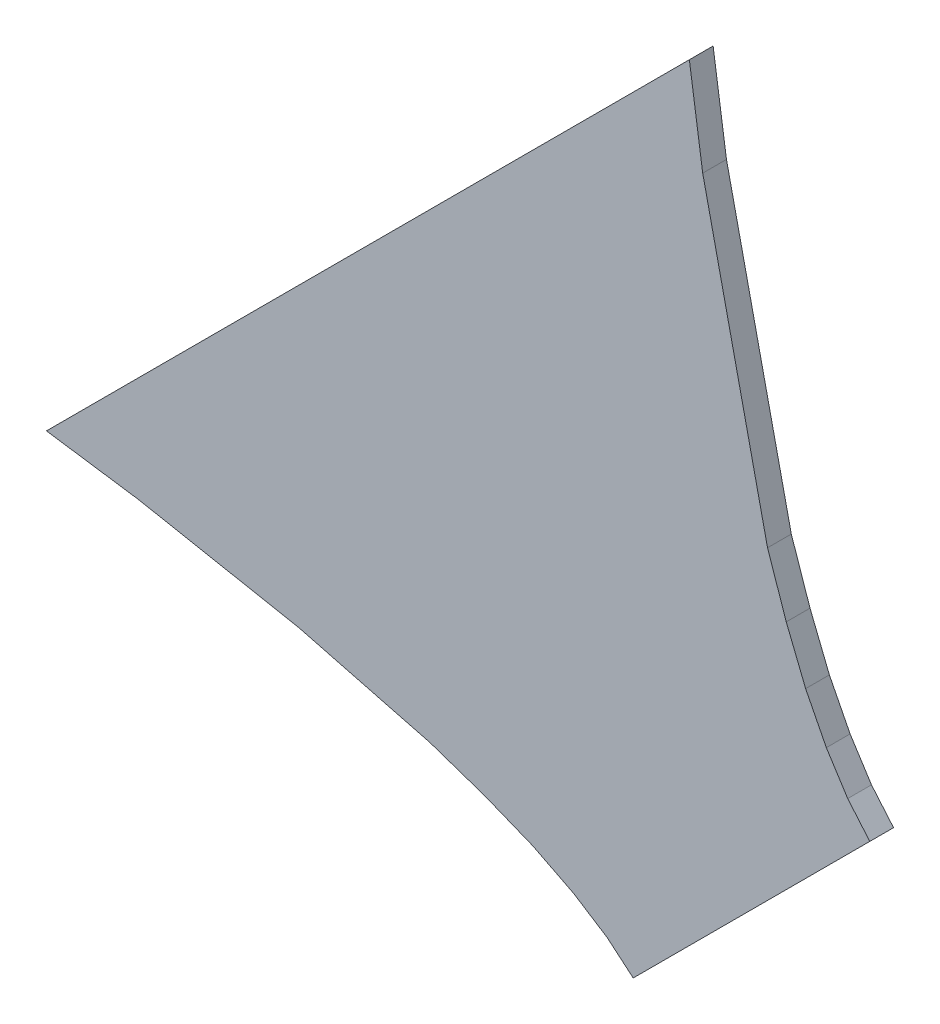
ISO-10303-21;
HEADER;
FILE_DESCRIPTION(('STEP AP214'),'2;1');
FILE_NAME('part.step','',(''),(''),'','','');
FILE_SCHEMA(('AUTOMOTIVE_DESIGN { 1 0 10303 214 1 1 1 1 }'));
ENDSEC;
DATA;
#1=APPLICATION_CONTEXT('core data for automotive mechanical design processes');
#2=APPLICATION_PROTOCOL_DEFINITION('international standard','automotive_design',2000,#1);
#3=PRODUCT_CONTEXT('',#1,'mechanical');
#4=PRODUCT('Part','Part','',(#3));
#5=PRODUCT_RELATED_PRODUCT_CATEGORY('part','',(#4));
#6=PRODUCT_DEFINITION_FORMATION('','',#4);
#7=PRODUCT_DEFINITION_CONTEXT('part definition',#1,'design');
#8=PRODUCT_DEFINITION('design','',#6,#7);
#9=PRODUCT_DEFINITION_SHAPE('','',#8);
#10=(LENGTH_UNIT() NAMED_UNIT(*) SI_UNIT(.MILLI.,.METRE.));
#11=(NAMED_UNIT(*) PLANE_ANGLE_UNIT() SI_UNIT($,.RADIAN.));
#12=(NAMED_UNIT(*) SI_UNIT($,.STERADIAN.) SOLID_ANGLE_UNIT());
#13=UNCERTAINTY_MEASURE_WITH_UNIT(LENGTH_MEASURE(1.E-05),#10,'distance_accuracy_value','');
#14=(GEOMETRIC_REPRESENTATION_CONTEXT(3) GLOBAL_UNCERTAINTY_ASSIGNED_CONTEXT((#13)) GLOBAL_UNIT_ASSIGNED_CONTEXT((#10,
#11,#12)) REPRESENTATION_CONTEXT('',''));
#15=CARTESIAN_POINT('',(0.,0.,0.));
#16=DIRECTION('',(0.,0.,1.));
#17=DIRECTION('',(1.,0.,0.));
#18=AXIS2_PLACEMENT_3D('',#15,#16,#17);
#19=CARTESIAN_POINT('',(61.0719985961914,74.5419998168945,0.));
#20=DIRECTION('',(-0.763425936268127,-0.645895378395862,0.));
#21=DIRECTION('',(-0.645895378395862,0.763425936268127,0.));
#22=AXIS2_PLACEMENT_3D('',#19,#20,#21);
#23=PLANE('',#22);
#24=DIRECTION('',(-0.645895378395862,0.763425936268127,0.));
#25=VECTOR('',#24,1.);
#26=CARTESIAN_POINT('',(61.0719985961914,74.5419998168945,0.03556));
#27=LINE('',#26,#25);
#28=CARTESIAN_POINT('',(61.0719985961914,74.5419998168945,0.03556));
#29=VERTEX_POINT('',#28);
#30=CARTESIAN_POINT('',(61.0390014648438,74.5810012817383,0.03556));
#31=VERTEX_POINT('',#30);
#32=EDGE_CURVE('E11',#29,#31,#27,.T.);
#33=ORIENTED_EDGE('',*,*,#32,.F.);
#34=DIRECTION('',(0.,0.,1.));
#35=VECTOR('',#34,1.);
#36=CARTESIAN_POINT('',(61.0719985961914,74.5419998168945,0.));
#37=LINE('',#36,#35);
#38=CARTESIAN_POINT('',(61.0719985961914,74.5419998168945,0.));
#39=VERTEX_POINT('',#38);
#40=EDGE_CURVE('E24',#39,#29,#37,.T.);
#41=ORIENTED_EDGE('',*,*,#40,.F.);
#42=DIRECTION('',(-0.645895378395862,0.763425936268127,0.));
#43=VECTOR('',#42,1.);
#44=CARTESIAN_POINT('',(61.0719985961914,74.5419998168945,0.));
#45=LINE('',#44,#43);
#46=CARTESIAN_POINT('',(61.0390014648438,74.5810012817383,0.));
#47=VERTEX_POINT('',#46);
#48=EDGE_CURVE('E154',#39,#47,#45,.T.);
#49=ORIENTED_EDGE('',*,*,#48,.T.);
#50=DIRECTION('',(0.,0.,1.));
#51=VECTOR('',#50,1.);
#52=CARTESIAN_POINT('',(61.0390014648438,74.5810012817383,0.));
#53=LINE('',#52,#51);
#54=EDGE_CURVE('E37',#47,#31,#53,.T.);
#55=ORIENTED_EDGE('',*,*,#54,.T.);
#56=EDGE_LOOP('',(#33,#41,#49,#55));
#57=FACE_BOUND('',#56,.T.);
#58=ADVANCED_FACE('F17',(#57),#23,.F.);
#59=CARTESIAN_POINT('',(61.0390014648438,74.5810012817383,0.));
#60=DIRECTION('',(-0.84223755306674,-0.539106579633518,0.));
#61=DIRECTION('',(-0.539106579633518,0.84223755306674,0.));
#62=AXIS2_PLACEMENT_3D('',#59,#60,#61);
#63=PLANE('',#62);
#64=DIRECTION('',(-0.539106579633518,0.84223755306674,0.));
#65=VECTOR('',#64,1.);
#66=CARTESIAN_POINT('',(61.0390014648438,74.5810012817383,0.03556));
#67=LINE('',#66,#65);
#68=CARTESIAN_POINT('',(61.0069999694824,74.6309967041016,0.03556));
#69=VERTEX_POINT('',#68);
#70=EDGE_CURVE('E266',#31,#69,#67,.T.);
#71=ORIENTED_EDGE('',*,*,#70,.F.);
#72=ORIENTED_EDGE('',*,*,#54,.F.);
#73=DIRECTION('',(-0.539106579633518,0.84223755306674,0.));
#74=VECTOR('',#73,1.);
#75=CARTESIAN_POINT('',(61.0390014648438,74.5810012817383,0.));
#76=LINE('',#75,#74);
#77=CARTESIAN_POINT('',(61.0069999694824,74.6309967041016,0.));
#78=VERTEX_POINT('',#77);
#79=EDGE_CURVE('E263',#47,#78,#76,.T.);
#80=ORIENTED_EDGE('',*,*,#79,.T.);
#81=DIRECTION('',(0.,0.,1.));
#82=VECTOR('',#81,1.);
#83=CARTESIAN_POINT('',(61.0069999694824,74.6309967041016,0.));
#84=LINE('',#83,#82);
#85=EDGE_CURVE('E261',#78,#69,#84,.T.);
#86=ORIENTED_EDGE('',*,*,#85,.T.);
#87=EDGE_LOOP('',(#71,#72,#80,#86));
#88=FACE_BOUND('',#87,.T.);
#89=ADVANCED_FACE('F274',(#88),#63,.F.);
#90=CARTESIAN_POINT('',(61.0069999694824,74.6309967041016,0.));
#91=DIRECTION('',(-0.891509544863293,-0.453001911052971,0.));
#92=DIRECTION('',(-0.453001911052971,0.891509544863293,0.));
#93=AXIS2_PLACEMENT_3D('',#90,#91,#92);
#94=PLANE('',#93);
#95=DIRECTION('',(-0.453001911052971,0.891509544863293,0.));
#96=VECTOR('',#95,1.);
#97=CARTESIAN_POINT('',(61.0069999694824,74.6309967041016,0.03556));
#98=LINE('',#97,#96);
#99=CARTESIAN_POINT('',(60.976001739502,74.6920013427734,0.03556));
#100=VERTEX_POINT('',#99);
#101=EDGE_CURVE('E258',#69,#100,#98,.T.);
#102=ORIENTED_EDGE('',*,*,#101,.F.);
#103=ORIENTED_EDGE('',*,*,#85,.F.);
#104=DIRECTION('',(-0.453001911052971,0.891509544863293,0.));
#105=VECTOR('',#104,1.);
#106=CARTESIAN_POINT('',(61.0069999694824,74.6309967041016,0.));
#107=LINE('',#106,#105);
#108=CARTESIAN_POINT('',(60.976001739502,74.6920013427734,0.));
#109=VERTEX_POINT('',#108);
#110=EDGE_CURVE('E255',#78,#109,#107,.T.);
#111=ORIENTED_EDGE('',*,*,#110,.T.);
#112=DIRECTION('',(0.,0.,1.));
#113=VECTOR('',#112,1.);
#114=CARTESIAN_POINT('',(60.976001739502,74.6920013427734,0.));
#115=LINE('',#114,#113);
#116=EDGE_CURVE('E253',#109,#100,#115,.T.);
#117=ORIENTED_EDGE('',*,*,#116,.T.);
#118=EDGE_LOOP('',(#102,#103,#111,#117));
#119=FACE_BOUND('',#118,.T.);
#120=ADVANCED_FACE('F280',(#119),#94,.F.);
#121=CARTESIAN_POINT('',(60.976001739502,74.6920013427734,0.));
#122=DIRECTION('',(-0.927568982596219,-0.373651953728889,0.));
#123=DIRECTION('',(-0.373651953728889,0.927568982596219,0.));
#124=AXIS2_PLACEMENT_3D('',#121,#122,#123);
#125=PLANE('',#124);
#126=DIRECTION('',(-0.373651953728889,0.927568982596219,0.));
#127=VECTOR('',#126,1.);
#128=CARTESIAN_POINT('',(60.976001739502,74.6920013427734,0.03556));
#129=LINE('',#128,#127);
#130=CARTESIAN_POINT('',(60.9469985961914,74.7639999389648,0.03556));
#131=VERTEX_POINT('',#130);
#132=EDGE_CURVE('E250',#100,#131,#129,.T.);
#133=ORIENTED_EDGE('',*,*,#132,.F.);
#134=ORIENTED_EDGE('',*,*,#116,.F.);
#135=DIRECTION('',(-0.373651953728889,0.927568982596219,0.));
#136=VECTOR('',#135,1.);
#137=CARTESIAN_POINT('',(60.976001739502,74.6920013427734,0.));
#138=LINE('',#137,#136);
#139=CARTESIAN_POINT('',(60.9469985961914,74.7639999389648,0.));
#140=VERTEX_POINT('',#139);
#141=EDGE_CURVE('E247',#109,#140,#138,.T.);
#142=ORIENTED_EDGE('',*,*,#141,.T.);
#143=DIRECTION('',(0.,0.,1.));
#144=VECTOR('',#143,1.);
#145=CARTESIAN_POINT('',(60.9469985961914,74.7639999389648,0.));
#146=LINE('',#145,#144);
#147=EDGE_CURVE('E245',#140,#131,#146,.T.);
#148=ORIENTED_EDGE('',*,*,#147,.T.);
#149=EDGE_LOOP('',(#133,#134,#142,#148));
#150=FACE_BOUND('',#149,.T.);
#151=ADVANCED_FACE('F282',(#150),#125,.F.);
#152=CARTESIAN_POINT('',(60.9469985961914,74.7639999389648,0.));
#153=DIRECTION('',(-0.946351169524934,-0.323140006713482,0.));
#154=DIRECTION('',(-0.323140006713482,0.946351169524934,0.));
#155=AXIS2_PLACEMENT_3D('',#152,#153,#154);
#156=PLANE('',#155);
#157=DIRECTION('',(-0.323140006713482,0.946351169524934,0.));
#158=VECTOR('',#157,1.);
#159=CARTESIAN_POINT('',(60.9469985961914,74.7639999389648,0.03556));
#160=LINE('',#159,#158);
#161=CARTESIAN_POINT('',(60.9189987182617,74.8460006713867,0.03556));
#162=VERTEX_POINT('',#161);
#163=EDGE_CURVE('E242',#131,#162,#160,.T.);
#164=ORIENTED_EDGE('',*,*,#163,.F.);
#165=ORIENTED_EDGE('',*,*,#147,.F.);
#166=DIRECTION('',(-0.323140006713482,0.946351169524934,0.));
#167=VECTOR('',#166,1.);
#168=CARTESIAN_POINT('',(60.9469985961914,74.7639999389648,0.));
#169=LINE('',#168,#167);
#170=CARTESIAN_POINT('',(60.9189987182617,74.8460006713867,0.));
#171=VERTEX_POINT('',#170);
#172=EDGE_CURVE('E239',#140,#171,#169,.T.);
#173=ORIENTED_EDGE('',*,*,#172,.T.);
#174=DIRECTION('',(0.,0.,1.));
#175=VECTOR('',#174,1.);
#176=CARTESIAN_POINT('',(60.9189987182617,74.8460006713867,0.));
#177=LINE('',#176,#175);
#178=EDGE_CURVE('E237',#171,#162,#177,.T.);
#179=ORIENTED_EDGE('',*,*,#178,.T.);
#180=EDGE_LOOP('',(#164,#165,#173,#179));
#181=FACE_BOUND('',#180,.T.);
#182=ADVANCED_FACE('F287',(#181),#156,.F.);
#183=CARTESIAN_POINT('',(60.9189987182617,74.8460006713867,0.));
#184=DIRECTION('',(-0.97623916620404,-0.216695847604982,0.));
#185=DIRECTION('',(-0.216695847604982,0.97623916620404,0.));
#186=AXIS2_PLACEMENT_3D('',#183,#184,#185);
#187=PLANE('',#186);
#188=DIRECTION('',(-0.216695847604982,0.97623916620404,0.));
#189=VECTOR('',#188,1.);
#190=CARTESIAN_POINT('',(60.9189987182617,74.8460006713867,0.03556));
#191=LINE('',#190,#189);
#192=CARTESIAN_POINT('',(60.8219985961914,75.2829971313477,0.03556));
#193=VERTEX_POINT('',#192);
#194=EDGE_CURVE('E234',#162,#193,#191,.T.);
#195=ORIENTED_EDGE('',*,*,#194,.F.);
#196=ORIENTED_EDGE('',*,*,#178,.F.);
#197=DIRECTION('',(-0.216695847604982,0.97623916620404,0.));
#198=VECTOR('',#197,1.);
#199=CARTESIAN_POINT('',(60.9189987182617,74.8460006713867,0.));
#200=LINE('',#199,#198);
#201=CARTESIAN_POINT('',(60.8219985961914,75.2829971313477,0.));
#202=VERTEX_POINT('',#201);
#203=EDGE_CURVE('E231',#171,#202,#200,.T.);
#204=ORIENTED_EDGE('',*,*,#203,.T.);
#205=DIRECTION('',(0.,0.,1.));
#206=VECTOR('',#205,1.);
#207=CARTESIAN_POINT('',(60.8219985961914,75.2829971313477,0.));
#208=LINE('',#207,#206);
#209=EDGE_CURVE('E229',#202,#193,#208,.T.);
#210=ORIENTED_EDGE('',*,*,#209,.T.);
#211=EDGE_LOOP('',(#195,#196,#204,#210));
#212=FACE_BOUND('',#211,.T.);
#213=ADVANCED_FACE('F290',(#212),#187,.F.);
#214=CARTESIAN_POINT('',(60.8219985961914,75.2829971313477,0.));
#215=DIRECTION('',(-0.989511166848601,-0.144456397165095,0.));
#216=DIRECTION('',(-0.144456397165095,0.989511166848601,0.));
#217=AXIS2_PLACEMENT_3D('',#214,#215,#216);
#218=PLANE('',#217);
#219=DIRECTION('',(-0.144456397165095,0.989511166848601,0.));
#220=VECTOR('',#219,1.);
#221=CARTESIAN_POINT('',(60.8219985961914,75.2829971313477,0.03556));
#222=LINE('',#221,#220);
#223=CARTESIAN_POINT('',(60.8019981384277,75.4199981689453,0.03556));
#224=VERTEX_POINT('',#223);
#225=EDGE_CURVE('E226',#193,#224,#222,.T.);
#226=ORIENTED_EDGE('',*,*,#225,.F.);
#227=ORIENTED_EDGE('',*,*,#209,.F.);
#228=DIRECTION('',(-0.144456397165095,0.989511166848601,0.));
#229=VECTOR('',#228,1.);
#230=CARTESIAN_POINT('',(60.8219985961914,75.2829971313477,0.));
#231=LINE('',#230,#229);
#232=CARTESIAN_POINT('',(60.8019981384277,75.4199981689453,0.));
#233=VERTEX_POINT('',#232);
#234=EDGE_CURVE('E223',#202,#233,#231,.T.);
#235=ORIENTED_EDGE('',*,*,#234,.T.);
#236=DIRECTION('',(0.,0.,1.));
#237=VECTOR('',#236,1.);
#238=CARTESIAN_POINT('',(60.8019981384277,75.4199981689453,0.));
#239=LINE('',#238,#237);
#240=EDGE_CURVE('E221',#233,#224,#239,.T.);
#241=ORIENTED_EDGE('',*,*,#240,.T.);
#242=EDGE_LOOP('',(#226,#227,#235,#241));
#243=FACE_BOUND('',#242,.T.);
#244=ADVANCED_FACE('F295',(#243),#218,.F.);
#245=CARTESIAN_POINT('',(60.8019981384277,75.4199981689453,0.));
#246=DIRECTION('',(0.707106781186548,-0.707106781186548,0.));
#247=DIRECTION('',(-0.707106781186548,-0.707106781186548,0.));
#248=AXIS2_PLACEMENT_3D('',#245,#246,#247);
#249=PLANE('',#248);
#250=DIRECTION('',(-0.707106781186548,-0.707106781186548,0.));
#251=VECTOR('',#250,1.);
#252=CARTESIAN_POINT('',(60.8019981384277,75.4199981689453,0.03556));
#253=LINE('',#252,#251);
#254=CARTESIAN_POINT('',(59.8400001525879,74.4580001831055,0.03556));
#255=VERTEX_POINT('',#254);
#256=EDGE_CURVE('E218',#224,#255,#253,.T.);
#257=ORIENTED_EDGE('',*,*,#256,.F.);
#258=ORIENTED_EDGE('',*,*,#240,.F.);
#259=DIRECTION('',(-0.707106781186548,-0.707106781186548,0.));
#260=VECTOR('',#259,1.);
#261=CARTESIAN_POINT('',(60.8019981384277,75.4199981689453,0.));
#262=LINE('',#261,#260);
#263=CARTESIAN_POINT('',(59.8400001525879,74.4580001831055,0.));
#264=VERTEX_POINT('',#263);
#265=EDGE_CURVE('E215',#233,#264,#262,.T.);
#266=ORIENTED_EDGE('',*,*,#265,.T.);
#267=DIRECTION('',(0.,0.,1.));
#268=VECTOR('',#267,1.);
#269=CARTESIAN_POINT('',(59.8400001525879,74.4580001831055,0.));
#270=LINE('',#269,#268);
#271=EDGE_CURVE('E213',#264,#255,#270,.T.);
#272=ORIENTED_EDGE('',*,*,#271,.T.);
#273=EDGE_LOOP('',(#257,#258,#266,#272));
#274=FACE_BOUND('',#273,.T.);
#275=ADVANCED_FACE('F298',(#274),#249,.F.);
#276=CARTESIAN_POINT('',(59.8400001525879,74.4580001831055,0.));
#277=DIRECTION('',(0.144429419714034,0.989515104847353,0.));
#278=DIRECTION('',(0.989515104847353,-0.144429419714034,0.));
#279=AXIS2_PLACEMENT_3D('',#276,#277,#278);
#280=PLANE('',#279);
#281=DIRECTION('',(0.989515104847353,-0.144429419714034,0.));
#282=VECTOR('',#281,1.);
#283=CARTESIAN_POINT('',(59.8400001525879,74.4580001831055,0.03556));
#284=LINE('',#283,#282);
#285=CARTESIAN_POINT('',(59.9770011901855,74.4380035400391,0.03556));
#286=VERTEX_POINT('',#285);
#287=EDGE_CURVE('E210',#255,#286,#284,.T.);
#288=ORIENTED_EDGE('',*,*,#287,.F.);
#289=ORIENTED_EDGE('',*,*,#271,.F.);
#290=DIRECTION('',(0.989515104847353,-0.144429419714034,0.));
#291=VECTOR('',#290,1.);
#292=CARTESIAN_POINT('',(59.8400001525879,74.4580001831055,0.));
#293=LINE('',#292,#291);
#294=CARTESIAN_POINT('',(59.9770011901855,74.4380035400391,0.));
#295=VERTEX_POINT('',#294);
#296=EDGE_CURVE('E207',#264,#295,#293,.T.);
#297=ORIENTED_EDGE('',*,*,#296,.T.);
#298=DIRECTION('',(0.,0.,1.));
#299=VECTOR('',#298,1.);
#300=CARTESIAN_POINT('',(59.9770011901855,74.4380035400391,0.));
#301=LINE('',#300,#299);
#302=EDGE_CURVE('E205',#295,#286,#301,.T.);
#303=ORIENTED_EDGE('',*,*,#302,.T.);
#304=EDGE_LOOP('',(#288,#289,#297,#303));
#305=FACE_BOUND('',#304,.T.);
#306=ADVANCED_FACE('F303',(#305),#280,.F.);
#307=CARTESIAN_POINT('',(59.9770011901855,74.4380035400391,0.));
#308=DIRECTION('',(0.188262578969288,0.982118730785557,0.));
#309=DIRECTION('',(0.982118730785557,-0.188262578969288,0.));
#310=AXIS2_PLACEMENT_3D('',#307,#308,#309);
#311=PLANE('',#310);
#312=DIRECTION('',(0.982118730785557,-0.188262578969288,0.));
#313=VECTOR('',#312,1.);
#314=CARTESIAN_POINT('',(59.9770011901855,74.4380035400391,0.03556));
#315=LINE('',#314,#313);
#316=CARTESIAN_POINT('',(60.2169990539551,74.3919982910156,0.03556));
#317=VERTEX_POINT('',#316);
#318=EDGE_CURVE('E202',#286,#317,#315,.T.);
#319=ORIENTED_EDGE('',*,*,#318,.F.);
#320=ORIENTED_EDGE('',*,*,#302,.F.);
#321=DIRECTION('',(0.982118730785557,-0.188262578969288,0.));
#322=VECTOR('',#321,1.);
#323=CARTESIAN_POINT('',(59.9770011901855,74.4380035400391,0.));
#324=LINE('',#323,#322);
#325=CARTESIAN_POINT('',(60.2169990539551,74.3919982910156,0.));
#326=VERTEX_POINT('',#325);
#327=EDGE_CURVE('E199',#295,#326,#324,.T.);
#328=ORIENTED_EDGE('',*,*,#327,.T.);
#329=DIRECTION('',(0.,0.,1.));
#330=VECTOR('',#329,1.);
#331=CARTESIAN_POINT('',(60.2169990539551,74.3919982910156,0.));
#332=LINE('',#331,#330);
#333=EDGE_CURVE('E197',#326,#317,#332,.T.);
#334=ORIENTED_EDGE('',*,*,#333,.T.);
#335=EDGE_LOOP('',(#319,#320,#328,#334));
#336=FACE_BOUND('',#335,.T.);
#337=ADVANCED_FACE('F306',(#336),#311,.F.);
#338=CARTESIAN_POINT('',(60.2169990539551,74.3919982910156,0.));
#339=DIRECTION('',(0.250594572569394,0.968092123818164,0.));
#340=DIRECTION('',(0.968092123818164,-0.250594572569394,0.));
#341=AXIS2_PLACEMENT_3D('',#338,#339,#340);
#342=PLANE('',#341);
#343=DIRECTION('',(0.968092123818164,-0.250594572569394,0.));
#344=VECTOR('',#343,1.);
#345=CARTESIAN_POINT('',(60.2169990539551,74.3919982910156,0.03556));
#346=LINE('',#345,#344);
#347=CARTESIAN_POINT('',(60.4140014648438,74.3410034179688,0.03556));
#348=VERTEX_POINT('',#347);
#349=EDGE_CURVE('E194',#317,#348,#346,.T.);
#350=ORIENTED_EDGE('',*,*,#349,.F.);
#351=ORIENTED_EDGE('',*,*,#333,.F.);
#352=DIRECTION('',(0.968092123818164,-0.250594572569394,0.));
#353=VECTOR('',#352,1.);
#354=CARTESIAN_POINT('',(60.2169990539551,74.3919982910156,0.));
#355=LINE('',#354,#353);
#356=CARTESIAN_POINT('',(60.4140014648438,74.3410034179688,0.));
#357=VERTEX_POINT('',#356);
#358=EDGE_CURVE('E191',#326,#357,#355,.T.);
#359=ORIENTED_EDGE('',*,*,#358,.T.);
#360=DIRECTION('',(0.,0.,1.));
#361=VECTOR('',#360,1.);
#362=CARTESIAN_POINT('',(60.4140014648438,74.3410034179688,0.));
#363=LINE('',#362,#361);
#364=EDGE_CURVE('E189',#357,#348,#363,.T.);
#365=ORIENTED_EDGE('',*,*,#364,.T.);
#366=EDGE_LOOP('',(#350,#351,#359,#365));
#367=FACE_BOUND('',#366,.T.);
#368=ADVANCED_FACE('F311',(#367),#342,.F.);
#369=CARTESIAN_POINT('',(60.4140014648438,74.3410034179688,0.));
#370=DIRECTION('',(0.323153470113885,0.946346572220429,0.));
#371=DIRECTION('',(0.946346572220429,-0.323153470113885,0.));
#372=AXIS2_PLACEMENT_3D('',#369,#370,#371);
#373=PLANE('',#372);
#374=DIRECTION('',(0.946346572220429,-0.323153470113884,0.));
#375=VECTOR('',#374,1.);
#376=CARTESIAN_POINT('',(60.4140014648438,74.3410034179688,0.03556));
#377=LINE('',#376,#375);
#378=CARTESIAN_POINT('',(60.4959983825684,74.3130035400391,0.03556));
#379=VERTEX_POINT('',#378);
#380=EDGE_CURVE('E186',#348,#379,#377,.T.);
#381=ORIENTED_EDGE('',*,*,#380,.F.);
#382=ORIENTED_EDGE('',*,*,#364,.F.);
#383=DIRECTION('',(0.946346572220429,-0.323153470113884,0.));
#384=VECTOR('',#383,1.);
#385=CARTESIAN_POINT('',(60.4140014648438,74.3410034179688,0.));
#386=LINE('',#385,#384);
#387=CARTESIAN_POINT('',(60.4959983825684,74.3130035400391,0.));
#388=VERTEX_POINT('',#387);
#389=EDGE_CURVE('E183',#357,#388,#386,.T.);
#390=ORIENTED_EDGE('',*,*,#389,.T.);
#391=DIRECTION('',(0.,0.,1.));
#392=VECTOR('',#391,1.);
#393=CARTESIAN_POINT('',(60.4959983825684,74.3130035400391,0.));
#394=LINE('',#393,#392);
#395=EDGE_CURVE('E181',#388,#379,#394,.T.);
#396=ORIENTED_EDGE('',*,*,#395,.T.);
#397=EDGE_LOOP('',(#381,#382,#390,#396));
#398=FACE_BOUND('',#397,.T.);
#399=ADVANCED_FACE('F314',(#398),#373,.F.);
#400=CARTESIAN_POINT('',(60.4959983825684,74.3130035400391,0.));
#401=DIRECTION('',(0.373677202662955,0.927558811186649,0.));
#402=DIRECTION('',(0.927558811186649,-0.373677202662955,0.));
#403=AXIS2_PLACEMENT_3D('',#400,#401,#402);
#404=PLANE('',#403);
#405=DIRECTION('',(0.927558811186649,-0.373677202662955,0.));
#406=VECTOR('',#405,1.);
#407=CARTESIAN_POINT('',(60.4959983825684,74.3130035400391,0.03556));
#408=LINE('',#407,#406);
#409=CARTESIAN_POINT('',(60.568000793457,74.2839965820313,0.03556));
#410=VERTEX_POINT('',#409);
#411=EDGE_CURVE('E178',#379,#410,#408,.T.);
#412=ORIENTED_EDGE('',*,*,#411,.F.);
#413=ORIENTED_EDGE('',*,*,#395,.F.);
#414=DIRECTION('',(0.927558811186649,-0.373677202662955,0.));
#415=VECTOR('',#414,1.);
#416=CARTESIAN_POINT('',(60.4959983825684,74.3130035400391,0.));
#417=LINE('',#416,#415);
#418=CARTESIAN_POINT('',(60.568000793457,74.2839965820313,0.));
#419=VERTEX_POINT('',#418);
#420=EDGE_CURVE('E175',#388,#419,#417,.T.);
#421=ORIENTED_EDGE('',*,*,#420,.T.);
#422=DIRECTION('',(0.,0.,1.));
#423=VECTOR('',#422,1.);
#424=CARTESIAN_POINT('',(60.568000793457,74.2839965820313,0.));
#425=LINE('',#424,#423);
#426=EDGE_CURVE('E173',#419,#410,#425,.T.);
#427=ORIENTED_EDGE('',*,*,#426,.T.);
#428=EDGE_LOOP('',(#412,#413,#421,#427));
#429=FACE_BOUND('',#428,.T.);
#430=ADVANCED_FACE('F319',(#429),#404,.F.);
#431=CARTESIAN_POINT('',(60.568000793457,74.2839965820313,0.));
#432=DIRECTION('',(0.453024425850483,0.891498104082583,0.));
#433=DIRECTION('',(0.891498104082583,-0.453024425850483,0.));
#434=AXIS2_PLACEMENT_3D('',#431,#432,#433);
#435=PLANE('',#434);
#436=DIRECTION('',(0.891498104082583,-0.453024425850483,0.));
#437=VECTOR('',#436,1.);
#438=CARTESIAN_POINT('',(60.568000793457,74.2839965820313,0.03556));
#439=LINE('',#438,#437);
#440=CARTESIAN_POINT('',(60.6290016174316,74.2529983520508,0.03556));
#441=VERTEX_POINT('',#440);
#442=EDGE_CURVE('E170',#410,#441,#439,.T.);
#443=ORIENTED_EDGE('',*,*,#442,.F.);
#444=ORIENTED_EDGE('',*,*,#426,.F.);
#445=DIRECTION('',(0.891498104082583,-0.453024425850483,0.));
#446=VECTOR('',#445,1.);
#447=CARTESIAN_POINT('',(60.568000793457,74.2839965820313,0.));
#448=LINE('',#447,#446);
#449=CARTESIAN_POINT('',(60.6290016174316,74.2529983520508,0.));
#450=VERTEX_POINT('',#449);
#451=EDGE_CURVE('E167',#419,#450,#448,.T.);
#452=ORIENTED_EDGE('',*,*,#451,.T.);
#453=DIRECTION('',(0.,0.,1.));
#454=VECTOR('',#453,1.);
#455=CARTESIAN_POINT('',(60.6290016174316,74.2529983520508,0.));
#456=LINE('',#455,#454);
#457=EDGE_CURVE('E165',#450,#441,#456,.T.);
#458=ORIENTED_EDGE('',*,*,#457,.T.);
#459=EDGE_LOOP('',(#443,#444,#452,#458));
#460=FACE_BOUND('',#459,.T.);
#461=ADVANCED_FACE('F322',(#460),#435,.F.);
#462=CARTESIAN_POINT('',(60.6290016174316,74.2529983520508,0.));
#463=DIRECTION('',(0.53903181352048,0.842285405318662,0.));
#464=DIRECTION('',(0.842285405318662,-0.53903181352048,0.));
#465=AXIS2_PLACEMENT_3D('',#462,#463,#464);
#466=PLANE('',#465);
#467=DIRECTION('',(0.842285405318662,-0.53903181352048,0.));
#468=VECTOR('',#467,1.);
#469=CARTESIAN_POINT('',(60.6290016174316,74.2529983520508,0.03556));
#470=LINE('',#469,#468);
#471=CARTESIAN_POINT('',(60.6790008544922,74.2210006713867,0.03556));
#472=VERTEX_POINT('',#471);
#473=EDGE_CURVE('E162',#441,#472,#470,.T.);
#474=ORIENTED_EDGE('',*,*,#473,.F.);
#475=ORIENTED_EDGE('',*,*,#457,.F.);
#476=DIRECTION('',(0.842285405318662,-0.53903181352048,0.));
#477=VECTOR('',#476,1.);
#478=CARTESIAN_POINT('',(60.6290016174316,74.2529983520508,0.));
#479=LINE('',#478,#477);
#480=CARTESIAN_POINT('',(60.6790008544922,74.2210006713867,0.));
#481=VERTEX_POINT('',#480);
#482=EDGE_CURVE('E160',#450,#481,#479,.T.);
#483=ORIENTED_EDGE('',*,*,#482,.T.);
#484=DIRECTION('',(0.,0.,1.));
#485=VECTOR('',#484,1.);
#486=CARTESIAN_POINT('',(60.6790008544922,74.2210006713867,0.));
#487=LINE('',#486,#485);
#488=EDGE_CURVE('E145',#481,#472,#487,.T.);
#489=ORIENTED_EDGE('',*,*,#488,.T.);
#490=EDGE_LOOP('',(#474,#475,#483,#489));
#491=FACE_BOUND('',#490,.T.);
#492=ADVANCED_FACE('F325',(#491),#466,.F.);
#493=CARTESIAN_POINT('',(60.6790008544922,74.2210006713867,0.));
#494=DIRECTION('',(0.645932199012131,0.76339478271688,0.));
#495=DIRECTION('',(0.76339478271688,-0.645932199012131,0.));
#496=AXIS2_PLACEMENT_3D('',#493,#494,#495);
#497=PLANE('',#496);
#498=DIRECTION('',(0.76339478271688,-0.645932199012131,0.));
#499=VECTOR('',#498,1.);
#500=CARTESIAN_POINT('',(60.6790008544922,74.2210006713867,0.03556));
#501=LINE('',#500,#499);
#502=CARTESIAN_POINT('',(60.7179985046387,74.1880035400391,0.03556));
#503=VERTEX_POINT('',#502);
#504=EDGE_CURVE('E149',#472,#503,#501,.T.);
#505=ORIENTED_EDGE('',*,*,#504,.F.);
#506=ORIENTED_EDGE('',*,*,#488,.F.);
#507=DIRECTION('',(0.76339478271688,-0.645932199012131,0.));
#508=VECTOR('',#507,1.);
#509=CARTESIAN_POINT('',(60.6790008544922,74.2210006713867,0.));
#510=LINE('',#509,#508);
#511=CARTESIAN_POINT('',(60.7179985046387,74.1880035400391,0.));
#512=VERTEX_POINT('',#511);
#513=EDGE_CURVE('E141',#481,#512,#510,.T.);
#514=ORIENTED_EDGE('',*,*,#513,.T.);
#515=DIRECTION('',(0.,0.,1.));
#516=VECTOR('',#515,1.);
#517=CARTESIAN_POINT('',(60.7179985046387,74.1880035400391,0.));
#518=LINE('',#517,#516);
#519=EDGE_CURVE('E131',#512,#503,#518,.T.);
#520=ORIENTED_EDGE('',*,*,#519,.T.);
#521=EDGE_LOOP('',(#505,#506,#514,#520));
#522=FACE_BOUND('',#521,.T.);
#523=ADVANCED_FACE('F144',(#522),#497,.F.);
#524=CARTESIAN_POINT('',(60.7179985046387,74.1880035400391,0.));
#525=DIRECTION('',(-0.70710297127213,0.707110591080437,0.));
#526=DIRECTION('',(0.707110591080437,0.70710297127213,0.));
#527=AXIS2_PLACEMENT_3D('',#524,#525,#526);
#528=PLANE('',#527);
#529=DIRECTION('',(0.707110591080437,0.70710297127213,0.));
#530=VECTOR('',#529,1.);
#531=CARTESIAN_POINT('',(60.7179985046387,74.1880035400391,0.03556));
#532=LINE('',#531,#530);
#533=EDGE_CURVE('E137',#503,#29,#532,.T.);
#534=ORIENTED_EDGE('',*,*,#533,.F.);
#535=ORIENTED_EDGE('',*,*,#519,.F.);
#536=DIRECTION('',(0.707110591080437,0.70710297127213,0.));
#537=VECTOR('',#536,1.);
#538=CARTESIAN_POINT('',(60.7179985046387,74.1880035400391,0.));
#539=LINE('',#538,#537);
#540=EDGE_CURVE('E135',#512,#39,#539,.T.);
#541=ORIENTED_EDGE('',*,*,#540,.T.);
#542=ORIENTED_EDGE('',*,*,#40,.T.);
#543=EDGE_LOOP('',(#534,#535,#541,#542));
#544=FACE_BOUND('',#543,.T.);
#545=ADVANCED_FACE('F133',(#544),#528,.F.);
#546=CARTESIAN_POINT('',(61.0719985961914,74.5419998168945,0.));
#547=DIRECTION('',(0.,0.,1.));
#548=DIRECTION('',(1.,0.,0.));
#549=AXIS2_PLACEMENT_3D('',#546,#547,#548);
#550=PLANE('',#549);
#551=ORIENTED_EDGE('',*,*,#540,.F.);
#552=ORIENTED_EDGE('',*,*,#513,.F.);
#553=ORIENTED_EDGE('',*,*,#482,.F.);
#554=ORIENTED_EDGE('',*,*,#451,.F.);
#555=ORIENTED_EDGE('',*,*,#420,.F.);
#556=ORIENTED_EDGE('',*,*,#389,.F.);
#557=ORIENTED_EDGE('',*,*,#358,.F.);
#558=ORIENTED_EDGE('',*,*,#327,.F.);
#559=ORIENTED_EDGE('',*,*,#296,.F.);
#560=ORIENTED_EDGE('',*,*,#265,.F.);
#561=ORIENTED_EDGE('',*,*,#234,.F.);
#562=ORIENTED_EDGE('',*,*,#203,.F.);
#563=ORIENTED_EDGE('',*,*,#172,.F.);
#564=ORIENTED_EDGE('',*,*,#141,.F.);
#565=ORIENTED_EDGE('',*,*,#110,.F.);
#566=ORIENTED_EDGE('',*,*,#79,.F.);
#567=ORIENTED_EDGE('',*,*,#48,.F.);
#568=EDGE_LOOP('',(#551,#552,#553,#554,#555,#556,#557,#558,#559,#560,#561,#562,#563,#564,#565,
#566,#567));
#569=FACE_BOUND('',#568,.T.);
#570=ADVANCED_FACE('F152',(#569),#550,.F.);
#571=CARTESIAN_POINT('',(61.0719985961914,74.5419998168945,0.03556));
#572=DIRECTION('',(0.,0.,1.));
#573=DIRECTION('',(1.,0.,0.));
#574=AXIS2_PLACEMENT_3D('',#571,#572,#573);
#575=PLANE('',#574);
#576=ORIENTED_EDGE('',*,*,#32,.T.);
#577=ORIENTED_EDGE('',*,*,#70,.T.);
#578=ORIENTED_EDGE('',*,*,#101,.T.);
#579=ORIENTED_EDGE('',*,*,#132,.T.);
#580=ORIENTED_EDGE('',*,*,#163,.T.);
#581=ORIENTED_EDGE('',*,*,#194,.T.);
#582=ORIENTED_EDGE('',*,*,#225,.T.);
#583=ORIENTED_EDGE('',*,*,#256,.T.);
#584=ORIENTED_EDGE('',*,*,#287,.T.);
#585=ORIENTED_EDGE('',*,*,#318,.T.);
#586=ORIENTED_EDGE('',*,*,#349,.T.);
#587=ORIENTED_EDGE('',*,*,#380,.T.);
#588=ORIENTED_EDGE('',*,*,#411,.T.);
#589=ORIENTED_EDGE('',*,*,#442,.T.);
#590=ORIENTED_EDGE('',*,*,#473,.T.);
#591=ORIENTED_EDGE('',*,*,#504,.T.);
#592=ORIENTED_EDGE('',*,*,#533,.T.);
#593=EDGE_LOOP('',(#576,#577,#578,#579,#580,#581,#582,#583,#584,#585,#586,#587,#588,#589,#590,
#591,#592));
#594=FACE_BOUND('',#593,.T.);
#595=ADVANCED_FACE('F277',(#594),#575,.T.);
#596=CLOSED_SHELL('',(#58,#89,#120,#151,#182,#213,#244,#275,#306,#337,#368,#399,#430,#461,#492,
#523,#545,#570,#595));
#597=MANIFOLD_SOLID_BREP('B1',#596);
#598=ADVANCED_BREP_SHAPE_REPRESENTATION('',(#18,#597),#14);
#599=SHAPE_DEFINITION_REPRESENTATION(#9,#598);
ENDSEC;
END-ISO-10303-21;
